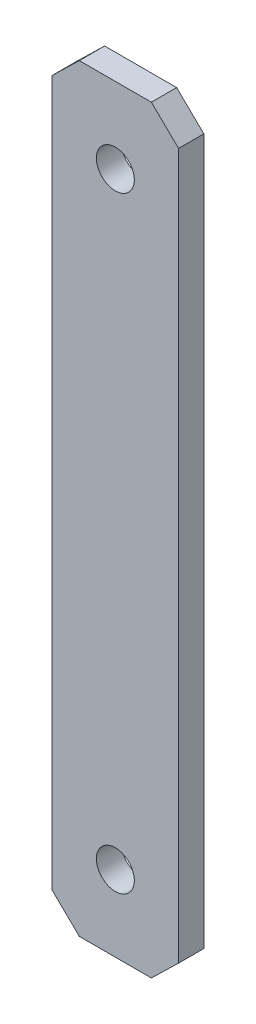
ISO-10303-21;
HEADER;
FILE_DESCRIPTION(('STEP AP214'),'2;1');
FILE_NAME('part.step','',(''),(''),'','','');
FILE_SCHEMA(('AUTOMOTIVE_DESIGN { 1 0 10303 214 1 1 1 1 }'));
ENDSEC;
DATA;
#1=APPLICATION_CONTEXT('core data for automotive mechanical design processes');
#2=APPLICATION_PROTOCOL_DEFINITION('international standard','automotive_design',2000,#1);
#3=PRODUCT_CONTEXT('',#1,'mechanical');
#4=PRODUCT('Part','Part','',(#3));
#5=PRODUCT_RELATED_PRODUCT_CATEGORY('part','',(#4));
#6=PRODUCT_DEFINITION_FORMATION('','',#4);
#7=PRODUCT_DEFINITION_CONTEXT('part definition',#1,'design');
#8=PRODUCT_DEFINITION('design','',#6,#7);
#9=PRODUCT_DEFINITION_SHAPE('','',#8);
#10=(LENGTH_UNIT() NAMED_UNIT(*) SI_UNIT(.MILLI.,.METRE.));
#11=(NAMED_UNIT(*) PLANE_ANGLE_UNIT() SI_UNIT($,.RADIAN.));
#12=(NAMED_UNIT(*) SI_UNIT($,.STERADIAN.) SOLID_ANGLE_UNIT());
#13=UNCERTAINTY_MEASURE_WITH_UNIT(LENGTH_MEASURE(1.E-05),#10,'distance_accuracy_value','');
#14=(GEOMETRIC_REPRESENTATION_CONTEXT(3) GLOBAL_UNCERTAINTY_ASSIGNED_CONTEXT((#13)) GLOBAL_UNIT_ASSIGNED_CONTEXT((#10,
#11,#12)) REPRESENTATION_CONTEXT('',''));
#15=CARTESIAN_POINT('',(0.,0.,0.));
#16=DIRECTION('',(0.,0.,1.));
#17=DIRECTION('',(1.,0.,0.));
#18=AXIS2_PLACEMENT_3D('',#15,#16,#17);
#19=CARTESIAN_POINT('',(7.84999999999999,57.9077524047093,-2.));
#20=DIRECTION('',(0.697415865096921,0.716666666666669,0.));
#21=DIRECTION('',(-0.716666666666668,0.697415865096921,0.));
#22=AXIS2_PLACEMENT_3D('',#19,#20,#21);
#23=PLANE('',#22);
#24=DIRECTION('',(-0.716666666666668,0.697415865096921,0.));
#25=VECTOR('',#24,1.);
#26=CARTESIAN_POINT('',(7.84999999999999,57.9077524047093,0.));
#27=LINE('',#26,#25);
#28=CARTESIAN_POINT('',(10.,55.8155048094185,0.));
#29=VERTEX_POINT('',#28);
#30=CARTESIAN_POINT('',(7.84999999999999,57.9077524047093,0.));
#31=VERTEX_POINT('',#30);
#32=EDGE_CURVE('E146',#29,#31,#27,.T.);
#33=ORIENTED_EDGE('',*,*,#32,.F.);
#34=DIRECTION('',(0.,0.,1.));
#35=VECTOR('',#34,1.);
#36=CARTESIAN_POINT('',(10.,55.8155048094185,-2.));
#37=LINE('',#36,#35);
#38=CARTESIAN_POINT('',(10.,55.8155048094185,-2.));
#39=VERTEX_POINT('',#38);
#40=EDGE_CURVE('E11',#39,#29,#37,.T.);
#41=ORIENTED_EDGE('',*,*,#40,.F.);
#42=DIRECTION('',(-0.716666666666668,0.697415865096921,0.));
#43=VECTOR('',#42,1.);
#44=CARTESIAN_POINT('',(7.84999999999999,57.9077524047093,-2.));
#45=LINE('',#44,#43);
#46=CARTESIAN_POINT('',(7.84999999999999,57.9077524047093,-2.));
#47=VERTEX_POINT('',#46);
#48=EDGE_CURVE('E175',#39,#47,#45,.T.);
#49=ORIENTED_EDGE('',*,*,#48,.T.);
#50=DIRECTION('',(0.,0.,1.));
#51=VECTOR('',#50,1.);
#52=CARTESIAN_POINT('',(7.84999999999999,57.9077524047093,-2.));
#53=LINE('',#52,#51);
#54=EDGE_CURVE('E46',#47,#31,#53,.T.);
#55=ORIENTED_EDGE('',*,*,#54,.T.);
#56=EDGE_LOOP('',(#33,#41,#49,#55));
#57=FACE_BOUND('',#56,.T.);
#58=ADVANCED_FACE('F43',(#57),#23,.T.);
#59=CARTESIAN_POINT('',(10.,0.,-2.));
#60=DIRECTION('',(1.,0.,0.));
#61=DIRECTION('',(0.,0.,-1.));
#62=AXIS2_PLACEMENT_3D('',#59,#60,#61);
#63=PLANE('',#62);
#64=DIRECTION('',(0.,1.,0.));
#65=VECTOR('',#64,1.);
#66=CARTESIAN_POINT('',(10.,0.,0.));
#67=LINE('',#66,#65);
#68=CARTESIAN_POINT('',(10.,0.,0.));
#69=VERTEX_POINT('',#68);
#70=EDGE_CURVE('E172',#69,#29,#67,.T.);
#71=ORIENTED_EDGE('',*,*,#70,.F.);
#72=DIRECTION('',(0.,0.,1.));
#73=VECTOR('',#72,1.);
#74=CARTESIAN_POINT('',(10.,0.,-2.));
#75=LINE('',#74,#73);
#76=CARTESIAN_POINT('',(10.,0.,-2.));
#77=VERTEX_POINT('',#76);
#78=EDGE_CURVE('E53',#77,#69,#75,.T.);
#79=ORIENTED_EDGE('',*,*,#78,.F.);
#80=DIRECTION('',(0.,1.,0.));
#81=VECTOR('',#80,1.);
#82=CARTESIAN_POINT('',(10.,0.,-2.));
#83=LINE('',#82,#81);
#84=EDGE_CURVE('E132',#77,#39,#83,.T.);
#85=ORIENTED_EDGE('',*,*,#84,.T.);
#86=ORIENTED_EDGE('',*,*,#40,.T.);
#87=EDGE_LOOP('',(#71,#79,#85,#86));
#88=FACE_BOUND('',#87,.T.);
#89=ADVANCED_FACE('F193',(#88),#63,.T.);
#90=CARTESIAN_POINT('',(7.84999999999998,-2.09224759529073,-2.));
#91=DIRECTION('',(0.697415865096905,-0.716666666666684,0.));
#92=DIRECTION('',(0.716666666666683,0.697415865096905,0.));
#93=AXIS2_PLACEMENT_3D('',#90,#91,#92);
#94=PLANE('',#93);
#95=DIRECTION('',(0.716666666666683,0.697415865096905,0.));
#96=VECTOR('',#95,1.);
#97=CARTESIAN_POINT('',(7.84999999999998,-2.09224759529073,0.));
#98=LINE('',#97,#96);
#99=CARTESIAN_POINT('',(7.84999999999998,-2.09224759529073,0.));
#100=VERTEX_POINT('',#99);
#101=EDGE_CURVE('E118',#100,#69,#98,.T.);
#102=ORIENTED_EDGE('',*,*,#101,.F.);
#103=DIRECTION('',(0.,0.,1.));
#104=VECTOR('',#103,1.);
#105=CARTESIAN_POINT('',(7.84999999999998,-2.09224759529073,-2.));
#106=LINE('',#105,#104);
#107=CARTESIAN_POINT('',(7.84999999999998,-2.09224759529073,-2.));
#108=VERTEX_POINT('',#107);
#109=EDGE_CURVE('E113',#108,#100,#106,.T.);
#110=ORIENTED_EDGE('',*,*,#109,.F.);
#111=DIRECTION('',(0.716666666666683,0.697415865096905,0.));
#112=VECTOR('',#111,1.);
#113=CARTESIAN_POINT('',(7.84999999999998,-2.09224759529073,-2.));
#114=LINE('',#113,#112);
#115=EDGE_CURVE('E116',#108,#77,#114,.T.);
#116=ORIENTED_EDGE('',*,*,#115,.T.);
#117=ORIENTED_EDGE('',*,*,#78,.T.);
#118=EDGE_LOOP('',(#102,#110,#116,#117));
#119=FACE_BOUND('',#118,.T.);
#120=ADVANCED_FACE('F115',(#119),#94,.T.);
#121=CARTESIAN_POINT('',(7.84999999999998,-2.09224759529073,-2.));
#122=DIRECTION('',(0.,-1.,0.));
#123=DIRECTION('',(1.,0.,0.));
#124=AXIS2_PLACEMENT_3D('',#121,#122,#123);
#125=PLANE('',#124);
#126=DIRECTION('',(1.,0.,0.));
#127=VECTOR('',#126,1.);
#128=CARTESIAN_POINT('',(7.84999999999998,-2.09224759529073,0.));
#129=LINE('',#128,#127);
#130=CARTESIAN_POINT('',(2.14999999999998,-2.09224759529074,0.));
#131=VERTEX_POINT('',#130);
#132=EDGE_CURVE('E167',#131,#100,#129,.T.);
#133=ORIENTED_EDGE('',*,*,#132,.F.);
#134=DIRECTION('',(0.,0.,1.));
#135=VECTOR('',#134,1.);
#136=CARTESIAN_POINT('',(2.14999999999998,-2.09224759529074,-2.));
#137=LINE('',#136,#135);
#138=CARTESIAN_POINT('',(2.14999999999998,-2.09224759529074,-2.));
#139=VERTEX_POINT('',#138);
#140=EDGE_CURVE('E124',#139,#131,#137,.T.);
#141=ORIENTED_EDGE('',*,*,#140,.F.);
#142=DIRECTION('',(1.,0.,0.));
#143=VECTOR('',#142,1.);
#144=CARTESIAN_POINT('',(7.84999999999998,-2.09224759529073,-2.));
#145=LINE('',#144,#143);
#146=EDGE_CURVE('E130',#139,#108,#145,.T.);
#147=ORIENTED_EDGE('',*,*,#146,.T.);
#148=ORIENTED_EDGE('',*,*,#109,.T.);
#149=EDGE_LOOP('',(#133,#141,#147,#148));
#150=FACE_BOUND('',#149,.T.);
#151=ADVANCED_FACE('F135',(#150),#125,.T.);
#152=CARTESIAN_POINT('',(0.,0.,-2.));
#153=DIRECTION('',(-0.697415865096921,-0.716666666666669,0.));
#154=DIRECTION('',(0.716666666666669,-0.697415865096921,0.));
#155=AXIS2_PLACEMENT_3D('',#152,#153,#154);
#156=PLANE('',#155);
#157=DIRECTION('',(0.716666666666669,-0.697415865096921,0.));
#158=VECTOR('',#157,1.);
#159=CARTESIAN_POINT('',(0.,0.,0.));
#160=LINE('',#159,#158);
#161=CARTESIAN_POINT('',(0.,0.,0.));
#162=VERTEX_POINT('',#161);
#163=EDGE_CURVE('E163',#162,#131,#160,.T.);
#164=ORIENTED_EDGE('',*,*,#163,.F.);
#165=DIRECTION('',(0.,0.,1.));
#166=VECTOR('',#165,1.);
#167=CARTESIAN_POINT('',(0.,0.,-2.));
#168=LINE('',#167,#166);
#169=CARTESIAN_POINT('',(0.,0.,-2.));
#170=VERTEX_POINT('',#169);
#171=EDGE_CURVE('E181',#170,#162,#168,.T.);
#172=ORIENTED_EDGE('',*,*,#171,.F.);
#173=DIRECTION('',(0.716666666666669,-0.697415865096921,0.));
#174=VECTOR('',#173,1.);
#175=CARTESIAN_POINT('',(0.,0.,-2.));
#176=LINE('',#175,#174);
#177=EDGE_CURVE('E137',#170,#139,#176,.T.);
#178=ORIENTED_EDGE('',*,*,#177,.T.);
#179=ORIENTED_EDGE('',*,*,#140,.T.);
#180=EDGE_LOOP('',(#164,#172,#178,#179));
#181=FACE_BOUND('',#180,.T.);
#182=ADVANCED_FACE('F206',(#181),#156,.T.);
#183=CARTESIAN_POINT('',(0.,0.,-2.));
#184=DIRECTION('',(-1.,0.,0.));
#185=DIRECTION('',(0.,0.,1.));
#186=AXIS2_PLACEMENT_3D('',#183,#184,#185);
#187=PLANE('',#186);
#188=DIRECTION('',(0.,-1.,0.));
#189=VECTOR('',#188,1.);
#190=CARTESIAN_POINT('',(0.,0.,0.));
#191=LINE('',#190,#189);
#192=CARTESIAN_POINT('',(0.,55.8155048094185,0.));
#193=VERTEX_POINT('',#192);
#194=EDGE_CURVE('E159',#193,#162,#191,.T.);
#195=ORIENTED_EDGE('',*,*,#194,.F.);
#196=DIRECTION('',(0.,0.,1.));
#197=VECTOR('',#196,1.);
#198=CARTESIAN_POINT('',(0.,55.8155048094185,-2.));
#199=LINE('',#198,#197);
#200=CARTESIAN_POINT('',(0.,55.8155048094185,-2.));
#201=VERTEX_POINT('',#200);
#202=EDGE_CURVE('E184',#201,#193,#199,.T.);
#203=ORIENTED_EDGE('',*,*,#202,.F.);
#204=DIRECTION('',(0.,-1.,0.));
#205=VECTOR('',#204,1.);
#206=CARTESIAN_POINT('',(0.,0.,-2.));
#207=LINE('',#206,#205);
#208=EDGE_CURVE('E140',#201,#170,#207,.T.);
#209=ORIENTED_EDGE('',*,*,#208,.T.);
#210=ORIENTED_EDGE('',*,*,#171,.T.);
#211=EDGE_LOOP('',(#195,#203,#209,#210));
#212=FACE_BOUND('',#211,.T.);
#213=ADVANCED_FACE('F209',(#212),#187,.T.);
#214=CARTESIAN_POINT('',(0.,55.8155048094185,-2.));
#215=DIRECTION('',(-0.697415865096917,0.716666666666672,0.));
#216=DIRECTION('',(-0.716666666666672,-0.697415865096917,0.));
#217=AXIS2_PLACEMENT_3D('',#214,#215,#216);
#218=PLANE('',#217);
#219=DIRECTION('',(-0.716666666666672,-0.697415865096917,0.));
#220=VECTOR('',#219,1.);
#221=CARTESIAN_POINT('',(0.,55.8155048094185,0.));
#222=LINE('',#221,#220);
#223=CARTESIAN_POINT('',(2.15000000000002,57.9077524047093,0.));
#224=VERTEX_POINT('',#223);
#225=EDGE_CURVE('E155',#224,#193,#222,.T.);
#226=ORIENTED_EDGE('',*,*,#225,.F.);
#227=DIRECTION('',(0.,0.,1.));
#228=VECTOR('',#227,1.);
#229=CARTESIAN_POINT('',(2.15000000000002,57.9077524047093,-2.));
#230=LINE('',#229,#228);
#231=CARTESIAN_POINT('',(2.15000000000002,57.9077524047093,-2.));
#232=VERTEX_POINT('',#231);
#233=EDGE_CURVE('E186',#232,#224,#230,.T.);
#234=ORIENTED_EDGE('',*,*,#233,.F.);
#235=DIRECTION('',(-0.716666666666672,-0.697415865096917,0.));
#236=VECTOR('',#235,1.);
#237=CARTESIAN_POINT('',(0.,55.8155048094185,-2.));
#238=LINE('',#237,#236);
#239=EDGE_CURVE('E261',#232,#201,#238,.T.);
#240=ORIENTED_EDGE('',*,*,#239,.T.);
#241=ORIENTED_EDGE('',*,*,#202,.T.);
#242=EDGE_LOOP('',(#226,#234,#240,#241));
#243=FACE_BOUND('',#242,.T.);
#244=ADVANCED_FACE('F213',(#243),#218,.T.);
#245=CARTESIAN_POINT('',(7.84999999999999,57.9077524047093,-2.));
#246=DIRECTION('',(0.,1.,0.));
#247=DIRECTION('',(0.,0.,1.));
#248=AXIS2_PLACEMENT_3D('',#245,#246,#247);
#249=PLANE('',#248);
#250=DIRECTION('',(-1.,0.,0.));
#251=VECTOR('',#250,1.);
#252=CARTESIAN_POINT('',(7.84999999999999,57.9077524047093,0.));
#253=LINE('',#252,#251);
#254=EDGE_CURVE('E150',#31,#224,#253,.T.);
#255=ORIENTED_EDGE('',*,*,#254,.F.);
#256=ORIENTED_EDGE('',*,*,#54,.F.);
#257=DIRECTION('',(-1.,0.,0.));
#258=VECTOR('',#257,1.);
#259=CARTESIAN_POINT('',(7.84999999999999,57.9077524047093,-2.));
#260=LINE('',#259,#258);
#261=EDGE_CURVE('E258',#47,#232,#260,.T.);
#262=ORIENTED_EDGE('',*,*,#261,.T.);
#263=ORIENTED_EDGE('',*,*,#233,.T.);
#264=EDGE_LOOP('',(#255,#256,#262,#263));
#265=FACE_BOUND('',#264,.T.);
#266=ADVANCED_FACE('F190',(#265),#249,.T.);
#267=CARTESIAN_POINT('',(0.,0.,-2.));
#268=DIRECTION('',(0.,0.,1.));
#269=DIRECTION('',(1.,0.,0.));
#270=AXIS2_PLACEMENT_3D('',#267,#268,#269);
#271=PLANE('',#270);
#272=CARTESIAN_POINT('',(5.,51.9077524047093,-2.));
#273=DIRECTION('',(0.,0.,1.));
#274=DIRECTION('',(1.,0.,0.));
#275=AXIS2_PLACEMENT_3D('',#272,#273,#274);
#276=CIRCLE('',#275,1.5);
#277=CARTESIAN_POINT('',(6.5,51.9077524047093,-2.));
#278=VERTEX_POINT('',#277);
#279=EDGE_CURVE('E151',#278,#278,#276,.T.);
#280=ORIENTED_EDGE('',*,*,#279,.T.);
#281=EDGE_LOOP('',(#280));
#282=FACE_BOUND('',#281,.T.);
#283=CARTESIAN_POINT('',(4.99999999999998,3.90775240470927,-2.));
#284=DIRECTION('',(0.,0.,1.));
#285=DIRECTION('',(1.,0.,0.));
#286=AXIS2_PLACEMENT_3D('',#283,#284,#285);
#287=CIRCLE('',#286,1.5);
#288=CARTESIAN_POINT('',(6.49999999999998,3.90775240470927,-2.));
#289=VERTEX_POINT('',#288);
#290=EDGE_CURVE('E250',#289,#289,#287,.T.);
#291=ORIENTED_EDGE('',*,*,#290,.T.);
#292=EDGE_LOOP('',(#291));
#293=FACE_BOUND('',#292,.T.);
#294=ORIENTED_EDGE('',*,*,#48,.F.);
#295=ORIENTED_EDGE('',*,*,#84,.F.);
#296=ORIENTED_EDGE('',*,*,#115,.F.);
#297=ORIENTED_EDGE('',*,*,#146,.F.);
#298=ORIENTED_EDGE('',*,*,#177,.F.);
#299=ORIENTED_EDGE('',*,*,#208,.F.);
#300=ORIENTED_EDGE('',*,*,#239,.F.);
#301=ORIENTED_EDGE('',*,*,#261,.F.);
#302=EDGE_LOOP('',(#294,#295,#296,#297,#298,#299,#300,#301));
#303=FACE_BOUND('',#302,.T.);
#304=ADVANCED_FACE('F128',(#282,#293,#303),#271,.F.);
#305=CARTESIAN_POINT('',(0.,0.,0.));
#306=DIRECTION('',(0.,0.,1.));
#307=DIRECTION('',(1.,0.,0.));
#308=AXIS2_PLACEMENT_3D('',#305,#306,#307);
#309=PLANE('',#308);
#310=CARTESIAN_POINT('',(5.,51.9077524047093,0.));
#311=DIRECTION('',(0.,0.,1.));
#312=DIRECTION('',(1.,0.,0.));
#313=AXIS2_PLACEMENT_3D('',#310,#311,#312);
#314=CIRCLE('',#313,1.5);
#315=CARTESIAN_POINT('',(6.5,51.9077524047093,0.));
#316=VERTEX_POINT('',#315);
#317=EDGE_CURVE('E242',#316,#316,#314,.T.);
#318=ORIENTED_EDGE('',*,*,#317,.F.);
#319=EDGE_LOOP('',(#318));
#320=FACE_BOUND('',#319,.T.);
#321=CARTESIAN_POINT('',(4.99999999999998,3.90775240470927,0.));
#322=DIRECTION('',(0.,0.,1.));
#323=DIRECTION('',(1.,0.,0.));
#324=AXIS2_PLACEMENT_3D('',#321,#322,#323);
#325=CIRCLE('',#324,1.5);
#326=CARTESIAN_POINT('',(6.49999999999998,3.90775240470927,0.));
#327=VERTEX_POINT('',#326);
#328=EDGE_CURVE('E244',#327,#327,#325,.T.);
#329=ORIENTED_EDGE('',*,*,#328,.F.);
#330=EDGE_LOOP('',(#329));
#331=FACE_BOUND('',#330,.T.);
#332=ORIENTED_EDGE('',*,*,#32,.T.);
#333=ORIENTED_EDGE('',*,*,#254,.T.);
#334=ORIENTED_EDGE('',*,*,#225,.T.);
#335=ORIENTED_EDGE('',*,*,#194,.T.);
#336=ORIENTED_EDGE('',*,*,#163,.T.);
#337=ORIENTED_EDGE('',*,*,#132,.T.);
#338=ORIENTED_EDGE('',*,*,#101,.T.);
#339=ORIENTED_EDGE('',*,*,#70,.T.);
#340=EDGE_LOOP('',(#332,#333,#334,#335,#336,#337,#338,#339));
#341=FACE_BOUND('',#340,.T.);
#342=ADVANCED_FACE('F192',(#320,#331,#341),#309,.T.);
#343=CARTESIAN_POINT('',(4.99999999999998,3.90775240470927,-2.));
#344=DIRECTION('',(0.,0.,1.));
#345=DIRECTION('',(1.,0.,0.));
#346=AXIS2_PLACEMENT_3D('',#343,#344,#345);
#347=CYLINDRICAL_SURFACE('',#346,1.5);
#348=ORIENTED_EDGE('',*,*,#290,.F.);
#349=EDGE_LOOP('',(#348));
#350=FACE_BOUND('',#349,.T.);
#351=ORIENTED_EDGE('',*,*,#328,.T.);
#352=EDGE_LOOP('',(#351));
#353=FACE_BOUND('',#352,.T.);
#354=ADVANCED_FACE('F225',(#350,#353),#347,.F.);
#355=CARTESIAN_POINT('',(5.,51.9077524047093,-2.));
#356=DIRECTION('',(0.,0.,1.));
#357=DIRECTION('',(1.,0.,0.));
#358=AXIS2_PLACEMENT_3D('',#355,#356,#357);
#359=CYLINDRICAL_SURFACE('',#358,1.5);
#360=ORIENTED_EDGE('',*,*,#279,.F.);
#361=EDGE_LOOP('',(#360));
#362=FACE_BOUND('',#361,.T.);
#363=ORIENTED_EDGE('',*,*,#317,.T.);
#364=EDGE_LOOP('',(#363));
#365=FACE_BOUND('',#364,.T.);
#366=ADVANCED_FACE('F232',(#362,#365),#359,.F.);
#367=CLOSED_SHELL('',(#58,#89,#120,#151,#182,#213,#244,#266,#304,#342,#354,#366));
#368=MANIFOLD_SOLID_BREP('B2',#367);
#369=ADVANCED_BREP_SHAPE_REPRESENTATION('',(#18,#368),#14);
#370=SHAPE_DEFINITION_REPRESENTATION(#9,#369);
ENDSEC;
END-ISO-10303-21;
